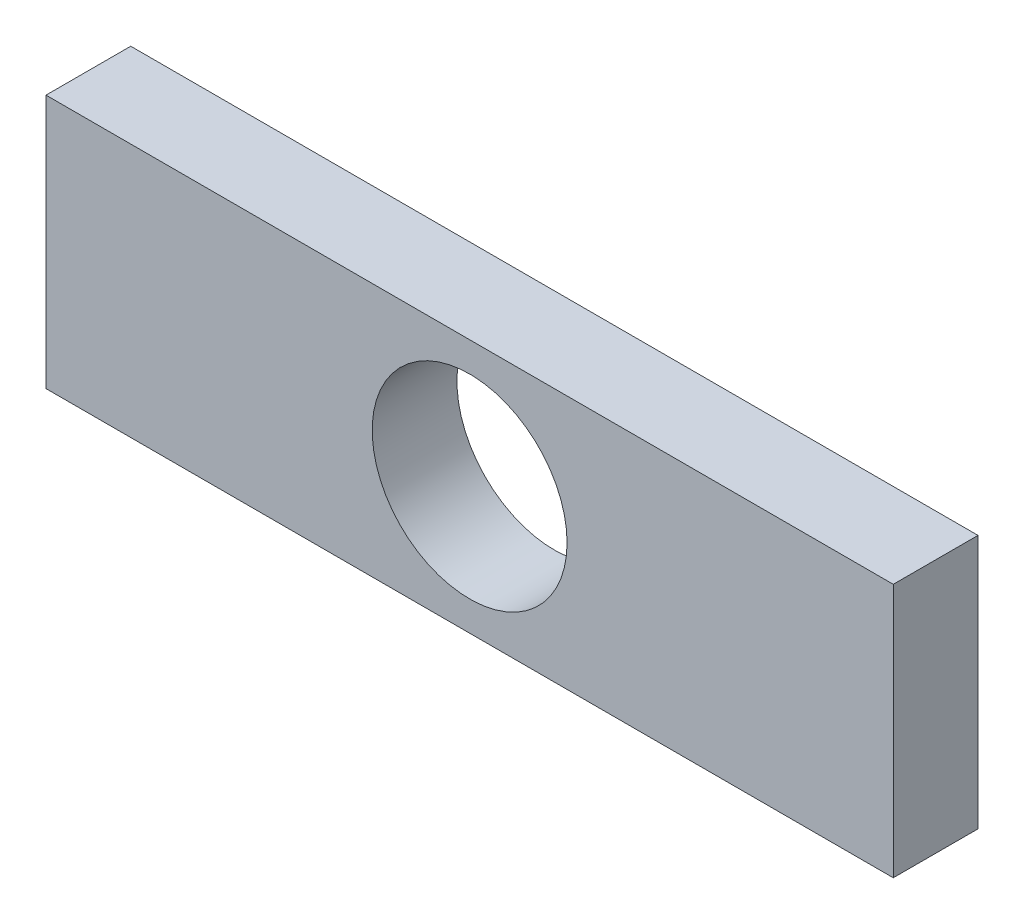
ISO-10303-21;
HEADER;
FILE_DESCRIPTION(('STEP AP214'),'2;1');
FILE_NAME('part.step','',(''),(''),'','','');
FILE_SCHEMA(('AUTOMOTIVE_DESIGN { 1 0 10303 214 1 1 1 1 }'));
ENDSEC;
DATA;
#1=APPLICATION_CONTEXT('core data for automotive mechanical design processes');
#2=APPLICATION_PROTOCOL_DEFINITION('international standard','automotive_design',2000,#1);
#3=PRODUCT_CONTEXT('',#1,'mechanical');
#4=PRODUCT('Part','Part','',(#3));
#5=PRODUCT_RELATED_PRODUCT_CATEGORY('part','',(#4));
#6=PRODUCT_DEFINITION_FORMATION('','',#4);
#7=PRODUCT_DEFINITION_CONTEXT('part definition',#1,'design');
#8=PRODUCT_DEFINITION('design','',#6,#7);
#9=PRODUCT_DEFINITION_SHAPE('','',#8);
#10=(LENGTH_UNIT() NAMED_UNIT(*) SI_UNIT(.MILLI.,.METRE.));
#11=(NAMED_UNIT(*) PLANE_ANGLE_UNIT() SI_UNIT($,.RADIAN.));
#12=(NAMED_UNIT(*) SI_UNIT($,.STERADIAN.) SOLID_ANGLE_UNIT());
#13=UNCERTAINTY_MEASURE_WITH_UNIT(LENGTH_MEASURE(1.E-05),#10,'distance_accuracy_value','');
#14=(GEOMETRIC_REPRESENTATION_CONTEXT(3) GLOBAL_UNCERTAINTY_ASSIGNED_CONTEXT((#13)) GLOBAL_UNIT_ASSIGNED_CONTEXT((#10,
#11,#12)) REPRESENTATION_CONTEXT('',''));
#15=CARTESIAN_POINT('',(0.,0.,0.));
#16=DIRECTION('',(0.,0.,1.));
#17=DIRECTION('',(1.,0.,0.));
#18=AXIS2_PLACEMENT_3D('',#15,#16,#17);
#19=CARTESIAN_POINT('',(0.,0.,2.));
#20=DIRECTION('',(0.,0.,1.));
#21=DIRECTION('',(1.,0.,0.));
#22=AXIS2_PLACEMENT_3D('',#19,#20,#21);
#23=PLANE('',#22);
#24=DIRECTION('',(0.,-1.,0.));
#25=VECTOR('',#24,1.);
#26=CARTESIAN_POINT('',(0.,0.,2.));
#27=LINE('',#26,#25);
#28=CARTESIAN_POINT('',(0.,0.,2.));
#29=VERTEX_POINT('',#28);
#30=CARTESIAN_POINT('',(0.,-6.,2.));
#31=VERTEX_POINT('',#30);
#32=EDGE_CURVE('E85',#29,#31,#27,.T.);
#33=ORIENTED_EDGE('',*,*,#32,.T.);
#34=DIRECTION('',(1.,0.,0.));
#35=VECTOR('',#34,1.);
#36=CARTESIAN_POINT('',(0.,-6.,2.));
#37=LINE('',#36,#35);
#38=CARTESIAN_POINT('',(20.,-6.,2.));
#39=VERTEX_POINT('',#38);
#40=EDGE_CURVE('E80',#31,#39,#37,.T.);
#41=ORIENTED_EDGE('',*,*,#40,.T.);
#42=DIRECTION('',(0.,1.,0.));
#43=VECTOR('',#42,1.);
#44=CARTESIAN_POINT('',(20.,0.,2.));
#45=LINE('',#44,#43);
#46=CARTESIAN_POINT('',(20.,0.,2.));
#47=VERTEX_POINT('',#46);
#48=EDGE_CURVE('E83',#39,#47,#45,.T.);
#49=ORIENTED_EDGE('',*,*,#48,.T.);
#50=DIRECTION('',(-1.,0.,0.));
#51=VECTOR('',#50,1.);
#52=CARTESIAN_POINT('',(0.,0.,2.));
#53=LINE('',#52,#51);
#54=EDGE_CURVE('E50',#47,#29,#53,.T.);
#55=ORIENTED_EDGE('',*,*,#54,.T.);
#56=EDGE_LOOP('',(#33,#41,#49,#55));
#57=FACE_BOUND('',#56,.T.);
#58=CARTESIAN_POINT('',(10.,-3.,2.));
#59=DIRECTION('',(0.,0.,1.));
#60=DIRECTION('',(1.,0.,0.));
#61=AXIS2_PLACEMENT_3D('',#58,#59,#60);
#62=CIRCLE('',#61,2.3);
#63=CARTESIAN_POINT('',(12.3,-3.,2.));
#64=VERTEX_POINT('',#63);
#65=EDGE_CURVE('E100',#64,#64,#62,.T.);
#66=ORIENTED_EDGE('',*,*,#65,.F.);
#67=EDGE_LOOP('',(#66));
#68=FACE_BOUND('',#67,.T.);
#69=ADVANCED_FACE('F33',(#57,#68),#23,.T.);
#70=CARTESIAN_POINT('',(0.,0.,0.));
#71=DIRECTION('',(0.,0.,1.));
#72=DIRECTION('',(1.,0.,0.));
#73=AXIS2_PLACEMENT_3D('',#70,#71,#72);
#74=PLANE('',#73);
#75=DIRECTION('',(0.,-1.,0.));
#76=VECTOR('',#75,1.);
#77=CARTESIAN_POINT('',(0.,0.,0.));
#78=LINE('',#77,#76);
#79=CARTESIAN_POINT('',(0.,0.,0.));
#80=VERTEX_POINT('',#79);
#81=CARTESIAN_POINT('',(0.,-6.,0.));
#82=VERTEX_POINT('',#81);
#83=EDGE_CURVE('E97',#80,#82,#78,.T.);
#84=ORIENTED_EDGE('',*,*,#83,.F.);
#85=DIRECTION('',(-1.,0.,0.));
#86=VECTOR('',#85,1.);
#87=CARTESIAN_POINT('',(0.,0.,0.));
#88=LINE('',#87,#86);
#89=CARTESIAN_POINT('',(20.,0.,0.));
#90=VERTEX_POINT('',#89);
#91=EDGE_CURVE('E73',#90,#80,#88,.T.);
#92=ORIENTED_EDGE('',*,*,#91,.F.);
#93=DIRECTION('',(0.,1.,0.));
#94=VECTOR('',#93,1.);
#95=CARTESIAN_POINT('',(20.,0.,0.));
#96=LINE('',#95,#94);
#97=CARTESIAN_POINT('',(20.,-6.,0.));
#98=VERTEX_POINT('',#97);
#99=EDGE_CURVE('E67',#98,#90,#96,.T.);
#100=ORIENTED_EDGE('',*,*,#99,.F.);
#101=DIRECTION('',(1.,0.,0.));
#102=VECTOR('',#101,1.);
#103=CARTESIAN_POINT('',(0.,-6.,0.));
#104=LINE('',#103,#102);
#105=EDGE_CURVE('E89',#82,#98,#104,.T.);
#106=ORIENTED_EDGE('',*,*,#105,.F.);
#107=EDGE_LOOP('',(#84,#92,#100,#106));
#108=FACE_BOUND('',#107,.T.);
#109=CARTESIAN_POINT('',(10.,-3.,0.));
#110=DIRECTION('',(0.,0.,1.));
#111=DIRECTION('',(1.,0.,0.));
#112=AXIS2_PLACEMENT_3D('',#109,#110,#111);
#113=CIRCLE('',#112,2.3);
#114=CARTESIAN_POINT('',(12.3,-3.,0.));
#115=VERTEX_POINT('',#114);
#116=EDGE_CURVE('E112',#115,#115,#113,.T.);
#117=ORIENTED_EDGE('',*,*,#116,.T.);
#118=EDGE_LOOP('',(#117));
#119=FACE_BOUND('',#118,.T.);
#120=ADVANCED_FACE('F108',(#108,#119),#74,.F.);
#121=CARTESIAN_POINT('',(0.,0.,2.));
#122=DIRECTION('',(1.,0.,0.));
#123=DIRECTION('',(0.,1.,0.));
#124=AXIS2_PLACEMENT_3D('',#121,#122,#123);
#125=PLANE('',#124);
#126=ORIENTED_EDGE('',*,*,#83,.T.);
#127=DIRECTION('',(0.,0.,-1.));
#128=VECTOR('',#127,1.);
#129=CARTESIAN_POINT('',(0.,-6.,2.));
#130=LINE('',#129,#128);
#131=EDGE_CURVE('E11',#31,#82,#130,.T.);
#132=ORIENTED_EDGE('',*,*,#131,.F.);
#133=ORIENTED_EDGE('',*,*,#32,.F.);
#134=DIRECTION('',(0.,0.,-1.));
#135=VECTOR('',#134,1.);
#136=CARTESIAN_POINT('',(0.,0.,2.));
#137=LINE('',#136,#135);
#138=EDGE_CURVE('E93',#29,#80,#137,.T.);
#139=ORIENTED_EDGE('',*,*,#138,.T.);
#140=EDGE_LOOP('',(#126,#132,#133,#139));
#141=FACE_BOUND('',#140,.T.);
#142=ADVANCED_FACE('F35',(#141),#125,.F.);
#143=CARTESIAN_POINT('',(0.,-6.,2.));
#144=DIRECTION('',(0.,1.,0.));
#145=DIRECTION('',(0.,0.,1.));
#146=AXIS2_PLACEMENT_3D('',#143,#144,#145);
#147=PLANE('',#146);
#148=ORIENTED_EDGE('',*,*,#105,.T.);
#149=DIRECTION('',(0.,0.,-1.));
#150=VECTOR('',#149,1.);
#151=CARTESIAN_POINT('',(20.,-6.,2.));
#152=LINE('',#151,#150);
#153=EDGE_CURVE('E42',#39,#98,#152,.T.);
#154=ORIENTED_EDGE('',*,*,#153,.F.);
#155=ORIENTED_EDGE('',*,*,#40,.F.);
#156=ORIENTED_EDGE('',*,*,#131,.T.);
#157=EDGE_LOOP('',(#148,#154,#155,#156));
#158=FACE_BOUND('',#157,.T.);
#159=ADVANCED_FACE('F88',(#158),#147,.F.);
#160=CARTESIAN_POINT('',(20.,0.,2.));
#161=DIRECTION('',(-1.,0.,0.));
#162=DIRECTION('',(0.,0.,1.));
#163=AXIS2_PLACEMENT_3D('',#160,#161,#162);
#164=PLANE('',#163);
#165=ORIENTED_EDGE('',*,*,#99,.T.);
#166=DIRECTION('',(0.,0.,-1.));
#167=VECTOR('',#166,1.);
#168=CARTESIAN_POINT('',(20.,0.,2.));
#169=LINE('',#168,#167);
#170=EDGE_CURVE('E90',#47,#90,#169,.T.);
#171=ORIENTED_EDGE('',*,*,#170,.F.);
#172=ORIENTED_EDGE('',*,*,#48,.F.);
#173=ORIENTED_EDGE('',*,*,#153,.T.);
#174=EDGE_LOOP('',(#165,#171,#172,#173));
#175=FACE_BOUND('',#174,.T.);
#176=ADVANCED_FACE('F91',(#175),#164,.F.);
#177=CARTESIAN_POINT('',(0.,0.,2.));
#178=DIRECTION('',(0.,-1.,0.));
#179=DIRECTION('',(0.,0.,-1.));
#180=AXIS2_PLACEMENT_3D('',#177,#178,#179);
#181=PLANE('',#180);
#182=ORIENTED_EDGE('',*,*,#91,.T.);
#183=ORIENTED_EDGE('',*,*,#138,.F.);
#184=ORIENTED_EDGE('',*,*,#54,.F.);
#185=ORIENTED_EDGE('',*,*,#170,.T.);
#186=EDGE_LOOP('',(#182,#183,#184,#185));
#187=FACE_BOUND('',#186,.T.);
#188=ADVANCED_FACE('F105',(#187),#181,.F.);
#189=CARTESIAN_POINT('',(10.,-3.,2.));
#190=DIRECTION('',(0.,0.,-1.));
#191=DIRECTION('',(-1.,0.,0.));
#192=AXIS2_PLACEMENT_3D('',#189,#190,#191);
#193=CYLINDRICAL_SURFACE('',#192,2.3);
#194=ORIENTED_EDGE('',*,*,#65,.T.);
#195=EDGE_LOOP('',(#194));
#196=FACE_BOUND('',#195,.T.);
#197=ORIENTED_EDGE('',*,*,#116,.F.);
#198=EDGE_LOOP('',(#197));
#199=FACE_BOUND('',#198,.T.);
#200=ADVANCED_FACE('F118',(#196,#199),#193,.F.);
#201=CLOSED_SHELL('',(#69,#120,#142,#159,#176,#188,#200));
#202=MANIFOLD_SOLID_BREP('B2',#201);
#203=ADVANCED_BREP_SHAPE_REPRESENTATION('',(#18,#202),#14);
#204=SHAPE_DEFINITION_REPRESENTATION(#9,#203);
ENDSEC;
END-ISO-10303-21;
